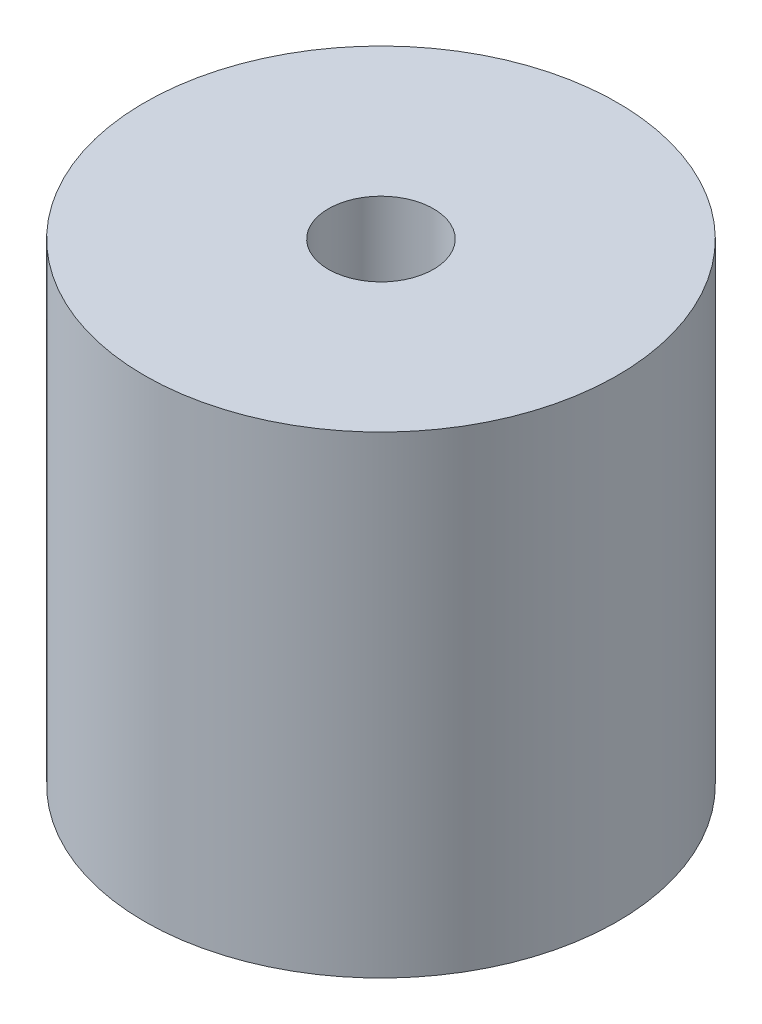
ISO-10303-21;
HEADER;
FILE_DESCRIPTION(('STEP AP214'),'2;1');
FILE_NAME('part.step','',(''),(''),'','','');
FILE_SCHEMA(('AUTOMOTIVE_DESIGN { 1 0 10303 214 1 1 1 1 }'));
ENDSEC;
DATA;
#1=APPLICATION_CONTEXT('core data for automotive mechanical design processes');
#2=APPLICATION_PROTOCOL_DEFINITION('international standard','automotive_design',2000,#1);
#3=PRODUCT_CONTEXT('',#1,'mechanical');
#4=PRODUCT('Part','Part','',(#3));
#5=PRODUCT_RELATED_PRODUCT_CATEGORY('part','',(#4));
#6=PRODUCT_DEFINITION_FORMATION('','',#4);
#7=PRODUCT_DEFINITION_CONTEXT('part definition',#1,'design');
#8=PRODUCT_DEFINITION('design','',#6,#7);
#9=PRODUCT_DEFINITION_SHAPE('','',#8);
#10=(LENGTH_UNIT() NAMED_UNIT(*) SI_UNIT(.MILLI.,.METRE.));
#11=(NAMED_UNIT(*) PLANE_ANGLE_UNIT() SI_UNIT($,.RADIAN.));
#12=(NAMED_UNIT(*) SI_UNIT($,.STERADIAN.) SOLID_ANGLE_UNIT());
#13=UNCERTAINTY_MEASURE_WITH_UNIT(LENGTH_MEASURE(1.E-05),#10,'distance_accuracy_value','');
#14=(GEOMETRIC_REPRESENTATION_CONTEXT(3) GLOBAL_UNCERTAINTY_ASSIGNED_CONTEXT((#13)) GLOBAL_UNIT_ASSIGNED_CONTEXT((#10,
#11,#12)) REPRESENTATION_CONTEXT('',''));
#15=CARTESIAN_POINT('',(0.,0.,0.));
#16=DIRECTION('',(0.,0.,1.));
#17=DIRECTION('',(1.,0.,0.));
#18=AXIS2_PLACEMENT_3D('',#15,#16,#17);
#19=CARTESIAN_POINT('',(0.,36.,0.));
#20=DIRECTION('',(0.,1.,0.));
#21=DIRECTION('',(0.,0.,1.));
#22=AXIS2_PLACEMENT_3D('',#19,#20,#21);
#23=PLANE('',#22);
#24=CARTESIAN_POINT('',(0.,36.,0.));
#25=DIRECTION('',(0.,1.,0.));
#26=DIRECTION('',(0.,0.,1.));
#27=AXIS2_PLACEMENT_3D('',#24,#25,#26);
#28=CIRCLE('',#27,18.);
#29=CARTESIAN_POINT('',(0.,36.,18.));
#30=VERTEX_POINT('',#29);
#31=EDGE_CURVE('E10',#30,#30,#28,.T.);
#32=ORIENTED_EDGE('',*,*,#31,.T.);
#33=EDGE_LOOP('',(#32));
#34=FACE_BOUND('',#33,.T.);
#35=CARTESIAN_POINT('',(0.,36.,0.));
#36=DIRECTION('',(0.,1.,0.));
#37=DIRECTION('',(0.,0.,1.));
#38=AXIS2_PLACEMENT_3D('',#35,#36,#37);
#39=CIRCLE('',#38,4.);
#40=CARTESIAN_POINT('',(0.,36.,4.));
#41=VERTEX_POINT('',#40);
#42=EDGE_CURVE('E50',#41,#41,#39,.T.);
#43=ORIENTED_EDGE('',*,*,#42,.F.);
#44=EDGE_LOOP('',(#43));
#45=FACE_BOUND('',#44,.T.);
#46=ADVANCED_FACE('F37',(#34,#45),#23,.T.);
#47=CARTESIAN_POINT('',(0.,0.,0.));
#48=DIRECTION('',(0.,1.,0.));
#49=DIRECTION('',(0.,0.,1.));
#50=AXIS2_PLACEMENT_3D('',#47,#48,#49);
#51=PLANE('',#50);
#52=CARTESIAN_POINT('',(0.,0.,0.));
#53=DIRECTION('',(0.,1.,0.));
#54=DIRECTION('',(0.,0.,1.));
#55=AXIS2_PLACEMENT_3D('',#52,#53,#54);
#56=CIRCLE('',#55,18.);
#57=CARTESIAN_POINT('',(0.,0.,18.));
#58=VERTEX_POINT('',#57);
#59=EDGE_CURVE('E41',#58,#58,#56,.T.);
#60=ORIENTED_EDGE('',*,*,#59,.F.);
#61=EDGE_LOOP('',(#60));
#62=FACE_BOUND('',#61,.T.);
#63=CARTESIAN_POINT('',(0.,0.,0.));
#64=DIRECTION('',(0.,1.,0.));
#65=DIRECTION('',(0.,0.,1.));
#66=AXIS2_PLACEMENT_3D('',#63,#64,#65);
#67=CIRCLE('',#66,4.);
#68=CARTESIAN_POINT('',(0.,0.,4.));
#69=VERTEX_POINT('',#68);
#70=EDGE_CURVE('E52',#69,#69,#67,.T.);
#71=ORIENTED_EDGE('',*,*,#70,.T.);
#72=EDGE_LOOP('',(#71));
#73=FACE_BOUND('',#72,.T.);
#74=ADVANCED_FACE('F64',(#62,#73),#51,.F.);
#75=CARTESIAN_POINT('',(0.,36.,0.));
#76=DIRECTION('',(0.,-1.,0.));
#77=DIRECTION('',(0.,0.,-1.));
#78=AXIS2_PLACEMENT_3D('',#75,#76,#77);
#79=CYLINDRICAL_SURFACE('',#78,18.);
#80=ORIENTED_EDGE('',*,*,#31,.F.);
#81=EDGE_LOOP('',(#80));
#82=FACE_BOUND('',#81,.T.);
#83=ORIENTED_EDGE('',*,*,#59,.T.);
#84=EDGE_LOOP('',(#83));
#85=FACE_BOUND('',#84,.T.);
#86=ADVANCED_FACE('F39',(#82,#85),#79,.T.);
#87=CARTESIAN_POINT('',(0.,36.,0.));
#88=DIRECTION('',(0.,-1.,0.));
#89=DIRECTION('',(0.,0.,-1.));
#90=AXIS2_PLACEMENT_3D('',#87,#88,#89);
#91=CYLINDRICAL_SURFACE('',#90,4.);
#92=ORIENTED_EDGE('',*,*,#42,.T.);
#93=EDGE_LOOP('',(#92));
#94=FACE_BOUND('',#93,.T.);
#95=ORIENTED_EDGE('',*,*,#70,.F.);
#96=EDGE_LOOP('',(#95));
#97=FACE_BOUND('',#96,.T.);
#98=ADVANCED_FACE('F60',(#94,#97),#91,.F.);
#99=CLOSED_SHELL('',(#46,#74,#86,#98));
#100=MANIFOLD_SOLID_BREP('B2',#99);
#101=ADVANCED_BREP_SHAPE_REPRESENTATION('',(#18,#100),#14);
#102=SHAPE_DEFINITION_REPRESENTATION(#9,#101);
ENDSEC;
END-ISO-10303-21;
